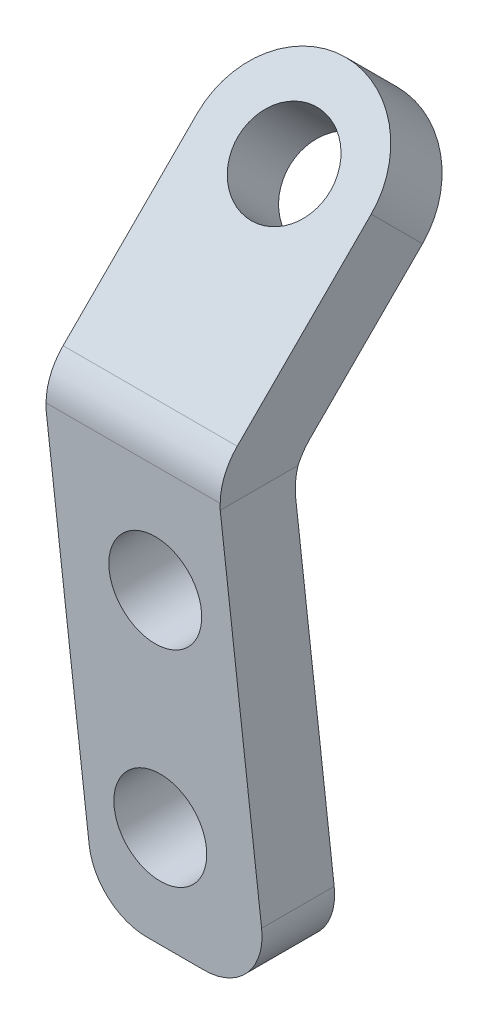
ISO-10303-21;
HEADER;
FILE_DESCRIPTION(('STEP AP214'),'2;1');
FILE_NAME('part.step','',(''),(''),'','','');
FILE_SCHEMA(('AUTOMOTIVE_DESIGN { 1 0 10303 214 1 1 1 1 }'));
ENDSEC;
DATA;
#1=APPLICATION_CONTEXT('core data for automotive mechanical design processes');
#2=APPLICATION_PROTOCOL_DEFINITION('international standard','automotive_design',2000,#1);
#3=PRODUCT_CONTEXT('',#1,'mechanical');
#4=PRODUCT('Part','Part','',(#3));
#5=PRODUCT_RELATED_PRODUCT_CATEGORY('part','',(#4));
#6=PRODUCT_DEFINITION_FORMATION('','',#4);
#7=PRODUCT_DEFINITION_CONTEXT('part definition',#1,'design');
#8=PRODUCT_DEFINITION('design','',#6,#7);
#9=PRODUCT_DEFINITION_SHAPE('','',#8);
#10=(LENGTH_UNIT() NAMED_UNIT(*) SI_UNIT(.MILLI.,.METRE.));
#11=(NAMED_UNIT(*) PLANE_ANGLE_UNIT() SI_UNIT($,.RADIAN.));
#12=(NAMED_UNIT(*) SI_UNIT($,.STERADIAN.) SOLID_ANGLE_UNIT());
#13=UNCERTAINTY_MEASURE_WITH_UNIT(LENGTH_MEASURE(1.E-05),#10,'distance_accuracy_value','');
#14=(GEOMETRIC_REPRESENTATION_CONTEXT(3) GLOBAL_UNCERTAINTY_ASSIGNED_CONTEXT((#13)) GLOBAL_UNIT_ASSIGNED_CONTEXT((#10,
#11,#12)) REPRESENTATION_CONTEXT('',''));
#15=CARTESIAN_POINT('',(0.,0.,0.));
#16=DIRECTION('',(0.,0.,1.));
#17=DIRECTION('',(1.,0.,0.));
#18=AXIS2_PLACEMENT_3D('',#15,#16,#17);
#19=CARTESIAN_POINT('',(-18.5,12.7986327394765,12.7986327394765));
#20=DIRECTION('',(0.,-0.707106781186546,-0.707106781186549));
#21=DIRECTION('',(0.,0.707106781186549,-0.707106781186546));
#22=AXIS2_PLACEMENT_3D('',#19,#20,#21);
#23=PLANE('',#22);
#24=CARTESIAN_POINT('',(-18.5,12.7986327394765,12.7986327394765));
#25=DIRECTION('',(0.,0.707106781186546,0.707106781186549));
#26=DIRECTION('',(0.,-0.707106781186549,0.707106781186546));
#27=AXIS2_PLACEMENT_3D('',#24,#25,#26);
#28=CIRCLE('',#27,1.6);
#29=CARTESIAN_POINT('',(-18.5,11.667261889578,13.930003589375));
#30=VERTEX_POINT('',#29);
#31=EDGE_CURVE('E177',#30,#30,#28,.T.);
#32=ORIENTED_EDGE('',*,*,#31,.F.);
#33=EDGE_LOOP('',(#32));
#34=FACE_BOUND('',#33,.T.);
#35=DIRECTION('',(0.,-0.707106781186549,0.707106781186546));
#36=VECTOR('',#35,1.);
#37=CARTESIAN_POINT('',(-21.5,5.72756516654719,19.8697003124058));
#38=LINE('',#37,#36);
#39=CARTESIAN_POINT('',(-21.5,12.7986329784127,12.7986325005404));
#40=VERTEX_POINT('',#39);
#41=CARTESIAN_POINT('',(-21.5,8.18305191657991,17.4142135623731));
#42=VERTEX_POINT('',#41);
#43=EDGE_CURVE('E170',#40,#42,#38,.T.);
#44=ORIENTED_EDGE('',*,*,#43,.T.);
#45=DIRECTION('',(-1.,0.,0.));
#46=VECTOR('',#45,1.);
#47=CARTESIAN_POINT('',(-15.5,8.18305191657991,17.4142135623731));
#48=LINE('',#47,#46);
#49=CARTESIAN_POINT('',(-15.5,8.18305191657991,17.4142135623731));
#50=VERTEX_POINT('',#49);
#51=EDGE_CURVE('E210',#42,#50,#48,.F.);
#52=ORIENTED_EDGE('',*,*,#51,.T.);
#53=DIRECTION('',(0.,0.707106781186549,-0.707106781186546));
#54=VECTOR('',#53,1.);
#55=CARTESIAN_POINT('',(-15.5,5.72756516654719,19.8697003124058));
#56=LINE('',#55,#54);
#57=CARTESIAN_POINT('',(-15.5,12.7986329784127,12.7986325005404));
#58=VERTEX_POINT('',#57);
#59=EDGE_CURVE('E194',#50,#58,#56,.T.);
#60=ORIENTED_EDGE('',*,*,#59,.T.);
#61=CARTESIAN_POINT('',(-18.5,12.7986327394765,12.7986327394765));
#62=DIRECTION('',(0.,0.707106781186546,0.707106781186549));
#63=DIRECTION('',(0.,0.707106781186549,-0.707106781186546));
#64=AXIS2_PLACEMENT_3D('',#61,#62,#63);
#65=CIRCLE('',#64,3.00000000000002);
#66=EDGE_CURVE('E188',#58,#40,#65,.T.);
#67=ORIENTED_EDGE('',*,*,#66,.T.);
#68=EDGE_LOOP('',(#44,#52,#60,#67));
#69=FACE_BOUND('',#68,.T.);
#70=ADVANCED_FACE('F33',(#34,#69),#23,.F.);
#71=CARTESIAN_POINT('',(-18.5,11.0308657865101,11.0308657865102));
#72=DIRECTION('',(0.,-0.707106781186546,-0.707106781186549));
#73=DIRECTION('',(0.,0.707106781186549,-0.707106781186546));
#74=AXIS2_PLACEMENT_3D('',#71,#72,#73);
#75=PLANE('',#74);
#76=DIRECTION('',(0.,0.707106781186549,-0.707106781186546));
#77=VECTOR('',#76,1.);
#78=CARTESIAN_POINT('',(-15.5,3.95979821358082,18.1019333594394));
#79=LINE('',#78,#77);
#80=CARTESIAN_POINT('',(-15.5,7.14751801064718,14.9142135623731));
#81=VERTEX_POINT('',#80);
#82=CARTESIAN_POINT('',(-15.5,11.0308660254463,11.030865547574));
#83=VERTEX_POINT('',#82);
#84=EDGE_CURVE('E186',#81,#83,#79,.T.);
#85=ORIENTED_EDGE('',*,*,#84,.F.);
#86=DIRECTION('',(-1.,0.,0.));
#87=VECTOR('',#86,1.);
#88=CARTESIAN_POINT('',(-18.5,7.14751801064718,14.9142135623731));
#89=LINE('',#88,#87);
#90=CARTESIAN_POINT('',(-21.5,7.14751801064718,14.9142135623731));
#91=VERTEX_POINT('',#90);
#92=EDGE_CURVE('E226',#81,#91,#89,.T.);
#93=ORIENTED_EDGE('',*,*,#92,.T.);
#94=DIRECTION('',(0.,-0.707106781186549,0.707106781186546));
#95=VECTOR('',#94,1.);
#96=CARTESIAN_POINT('',(-21.5,3.95979821358082,18.1019333594394));
#97=LINE('',#96,#95);
#98=CARTESIAN_POINT('',(-21.5,11.0308660254463,11.030865547574));
#99=VERTEX_POINT('',#98);
#100=EDGE_CURVE('E181',#99,#91,#97,.T.);
#101=ORIENTED_EDGE('',*,*,#100,.F.);
#102=CARTESIAN_POINT('',(-18.5,11.0308657865101,11.0308657865102));
#103=DIRECTION('',(0.,0.707106781186546,0.707106781186549));
#104=DIRECTION('',(0.,0.707106781186549,-0.707106781186546));
#105=AXIS2_PLACEMENT_3D('',#102,#103,#104);
#106=CIRCLE('',#105,3.00000000000002);
#107=EDGE_CURVE('E185',#83,#99,#106,.T.);
#108=ORIENTED_EDGE('',*,*,#107,.F.);
#109=EDGE_LOOP('',(#85,#93,#101,#108));
#110=FACE_BOUND('',#109,.T.);
#111=CARTESIAN_POINT('',(-18.5,11.0308657865101,11.0308657865102));
#112=DIRECTION('',(0.,0.707106781186546,0.707106781186549));
#113=DIRECTION('',(0.,-0.707106781186549,0.707106781186546));
#114=AXIS2_PLACEMENT_3D('',#111,#112,#113);
#115=CIRCLE('',#114,1.6);
#116=CARTESIAN_POINT('',(-18.5,9.89949493661164,12.1622366364086));
#117=VERTEX_POINT('',#116);
#118=EDGE_CURVE('E173',#117,#117,#115,.F.);
#119=ORIENTED_EDGE('',*,*,#118,.F.);
#120=EDGE_LOOP('',(#119));
#121=FACE_BOUND('',#120,.T.);
#122=ADVANCED_FACE('F250',(#110,#121),#75,.T.);
#123=CARTESIAN_POINT('',(-15.5,5.72756516654719,19.8697003124058));
#124=DIRECTION('',(-1.,0.,0.));
#125=DIRECTION('',(0.,-1.,0.));
#126=AXIS2_PLACEMENT_3D('',#123,#124,#125);
#127=PLANE('',#126);
#128=ORIENTED_EDGE('',*,*,#59,.F.);
#129=CARTESIAN_POINT('',(-15.5,6.76883835420682,16.));
#130=DIRECTION('',(-1.,0.,0.));
#131=DIRECTION('',(0.,-1.,0.));
#132=AXIS2_PLACEMENT_3D('',#129,#130,#131);
#133=CIRCLE('',#132,2.);
#134=CARTESIAN_POINT('',(-15.5,6.76883835420682,18.));
#135=VERTEX_POINT('',#134);
#136=EDGE_CURVE('E145',#50,#135,#133,.F.);
#137=ORIENTED_EDGE('',*,*,#136,.T.);
#138=DIRECTION('',(0.,1.,0.));
#139=VECTOR('',#138,1.);
#140=CARTESIAN_POINT('',(-15.5,6.56173157302027,18.));
#141=LINE('',#140,#139);
#142=CARTESIAN_POINT('',(-15.5,6.56173157302027,18.));
#143=VERTEX_POINT('',#142);
#144=EDGE_CURVE('E126',#143,#135,#141,.T.);
#145=ORIENTED_EDGE('',*,*,#144,.F.);
#146=DIRECTION('',(0.,0.,-1.));
#147=VECTOR('',#146,1.);
#148=CARTESIAN_POINT('',(-15.5,6.56173157302027,18.));
#149=LINE('',#148,#147);
#150=CARTESIAN_POINT('',(-15.5,6.56173157302027,15.3203594422489));
#151=VERTEX_POINT('',#150);
#152=EDGE_CURVE('E47',#143,#151,#149,.T.);
#153=ORIENTED_EDGE('',*,*,#152,.T.);
#154=CARTESIAN_POINT('',(-15.5,5.73330444827409,13.5));
#155=DIRECTION('',(-1.,0.,0.));
#156=DIRECTION('',(0.,-1.,0.));
#157=AXIS2_PLACEMENT_3D('',#154,#155,#156);
#158=CIRCLE('',#157,2.);
#159=EDGE_CURVE('E11',#151,#81,#158,.T.);
#160=ORIENTED_EDGE('',*,*,#159,.T.);
#161=ORIENTED_EDGE('',*,*,#84,.T.);
#162=DIRECTION('',(0.,-0.707106781186546,-0.707106781186549));
#163=VECTOR('',#162,1.);
#164=CARTESIAN_POINT('',(-15.5,12.7986329784127,12.7986325005404));
#165=LINE('',#164,#163);
#166=EDGE_CURVE('E182',#58,#83,#165,.T.);
#167=ORIENTED_EDGE('',*,*,#166,.F.);
#168=EDGE_LOOP('',(#128,#137,#145,#153,#160,#161,#167));
#169=FACE_BOUND('',#168,.T.);
#170=ADVANCED_FACE('F143',(#169),#127,.F.);
#171=CARTESIAN_POINT('',(-18.5,12.7986327394765,12.7986327394765));
#172=DIRECTION('',(0.,-0.707106781186546,-0.707106781186549));
#173=DIRECTION('',(0.,0.707106781186549,-0.707106781186546));
#174=AXIS2_PLACEMENT_3D('',#171,#172,#173);
#175=CYLINDRICAL_SURFACE('',#174,3.00000000000002);
#176=ORIENTED_EDGE('',*,*,#107,.T.);
#177=DIRECTION('',(0.,-0.707106781186546,-0.707106781186549));
#178=VECTOR('',#177,1.);
#179=CARTESIAN_POINT('',(-21.5,12.7986329784127,12.7986325005404));
#180=LINE('',#179,#178);
#181=EDGE_CURVE('E178',#40,#99,#180,.T.);
#182=ORIENTED_EDGE('',*,*,#181,.F.);
#183=ORIENTED_EDGE('',*,*,#66,.F.);
#184=ORIENTED_EDGE('',*,*,#166,.T.);
#185=EDGE_LOOP('',(#176,#182,#183,#184));
#186=FACE_BOUND('',#185,.T.);
#187=ADVANCED_FACE('F255',(#186),#175,.T.);
#188=CARTESIAN_POINT('',(-18.5,12.7986327394765,12.7986327394765));
#189=DIRECTION('',(0.,-0.707106781186546,-0.707106781186549));
#190=DIRECTION('',(0.,0.707106781186549,-0.707106781186546));
#191=AXIS2_PLACEMENT_3D('',#188,#189,#190);
#192=CYLINDRICAL_SURFACE('',#191,1.6);
#193=ORIENTED_EDGE('',*,*,#31,.T.);
#194=EDGE_LOOP('',(#193));
#195=FACE_BOUND('',#194,.T.);
#196=ORIENTED_EDGE('',*,*,#118,.T.);
#197=EDGE_LOOP('',(#196));
#198=FACE_BOUND('',#197,.T.);
#199=ADVANCED_FACE('F273',(#195,#198),#192,.F.);
#200=CARTESIAN_POINT('',(0.,0.,15.5));
#201=DIRECTION('',(0.,0.,1.));
#202=DIRECTION('',(1.,0.,0.));
#203=AXIS2_PLACEMENT_3D('',#200,#201,#202);
#204=PLANE('',#203);
#205=CARTESIAN_POINT('',(-17.564365692009,-3.93612218272979,15.5));
#206=DIRECTION('',(0.,0.,-1.));
#207=DIRECTION('',(-1.,0.,0.));
#208=AXIS2_PLACEMENT_3D('',#205,#206,#207);
#209=CIRCLE('',#208,1.6);
#210=CARTESIAN_POINT('',(-19.164365692009,-3.93612218272979,15.5));
#211=VERTEX_POINT('',#210);
#212=EDGE_CURVE('E159',#211,#211,#209,.T.);
#213=ORIENTED_EDGE('',*,*,#212,.F.);
#214=EDGE_LOOP('',(#213));
#215=FACE_BOUND('',#214,.T.);
#216=CARTESIAN_POINT('',(-17.7376943195775,3.06173157302027,15.5));
#217=DIRECTION('',(0.,0.,-1.));
#218=DIRECTION('',(-1.,0.,0.));
#219=AXIS2_PLACEMENT_3D('',#216,#217,#218);
#220=CIRCLE('',#219,1.6);
#221=CARTESIAN_POINT('',(-19.3376943195775,3.06173157302027,15.5));
#222=VERTEX_POINT('',#221);
#223=EDGE_CURVE('E164',#222,#222,#220,.T.);
#224=ORIENTED_EDGE('',*,*,#223,.F.);
#225=EDGE_LOOP('',(#224));
#226=FACE_BOUND('',#225,.T.);
#227=DIRECTION('',(-0.120424606683781,0.992722475873825,0.));
#228=VECTOR('',#227,1.);
#229=CARTESIAN_POINT('',(-13.8020865915625,-7.43504906060482,15.5));
#230=LINE('',#229,#228);
#231=CARTESIAN_POINT('',(-14.0739182380858,-5.19419984723726,15.5));
#232=VERTEX_POINT('',#231);
#233=CARTESIAN_POINT('',(-15.399505639201,5.73330444827408,15.5));
#234=VERTEX_POINT('',#233);
#235=EDGE_CURVE('E152',#232,#234,#230,.T.);
#236=ORIENTED_EDGE('',*,*,#235,.F.);
#237=CARTESIAN_POINT('',(-16.0593631898334,-5.43504906060482,15.5));
#238=DIRECTION('',(0.,0.,1.));
#239=DIRECTION('',(1.,0.,0.));
#240=AXIS2_PLACEMENT_3D('',#237,#238,#239);
#241=CIRCLE('',#240,2.);
#242=CARTESIAN_POINT('',(-16.0593631898334,-7.43504906060482,15.5));
#243=VERTEX_POINT('',#242);
#244=EDGE_CURVE('E219',#232,#243,#241,.F.);
#245=ORIENTED_EDGE('',*,*,#244,.T.);
#246=DIRECTION('',(1.,0.,0.));
#247=VECTOR('',#246,1.);
#248=CARTESIAN_POINT('',(-19.8020865915625,-7.43504906060482,15.5));
#249=LINE('',#248,#247);
#250=CARTESIAN_POINT('',(-18.0300396908575,-7.43504906060482,15.5));
#251=VERTEX_POINT('',#250);
#252=EDGE_CURVE('E134',#251,#243,#249,.T.);
#253=ORIENTED_EDGE('',*,*,#252,.F.);
#254=CARTESIAN_POINT('',(-18.0300396908575,-5.43504906060482,15.5));
#255=DIRECTION('',(0.,0.,1.));
#256=DIRECTION('',(1.,0.,0.));
#257=AXIS2_PLACEMENT_3D('',#254,#255,#256);
#258=CIRCLE('',#257,2.);
#259=CARTESIAN_POINT('',(-20.0154846426051,-5.67589827397238,15.5));
#260=VERTEX_POINT('',#259);
#261=EDGE_CURVE('E215',#251,#260,#258,.F.);
#262=ORIENTED_EDGE('',*,*,#261,.T.);
#263=DIRECTION('',(0.120424606683781,-0.992722475873825,0.));
#264=VECTOR('',#263,1.);
#265=CARTESIAN_POINT('',(-21.5,6.56173157302027,15.5));
#266=LINE('',#265,#264);
#267=CARTESIAN_POINT('',(-21.399505639201,5.73330444827409,15.5));
#268=VERTEX_POINT('',#267);
#269=EDGE_CURVE('E154',#268,#260,#266,.T.);
#270=ORIENTED_EDGE('',*,*,#269,.F.);
#271=DIRECTION('',(-1.,0.,0.));
#272=VECTOR('',#271,1.);
#273=CARTESIAN_POINT('',(0.,5.73330444827409,15.5));
#274=LINE('',#273,#272);
#275=EDGE_CURVE('E217',#268,#234,#274,.F.);
#276=ORIENTED_EDGE('',*,*,#275,.T.);
#277=EDGE_LOOP('',(#236,#245,#253,#262,#270,#276));
#278=FACE_BOUND('',#277,.T.);
#279=ADVANCED_FACE('F242',(#215,#226,#278),#204,.F.);
#280=CARTESIAN_POINT('',(0.,0.,18.));
#281=DIRECTION('',(0.,0.,1.));
#282=DIRECTION('',(1.,0.,0.));
#283=AXIS2_PLACEMENT_3D('',#280,#281,#282);
#284=PLANE('',#283);
#285=CARTESIAN_POINT('',(-17.564365692009,-3.93612218272979,18.));
#286=DIRECTION('',(0.,0.,-1.));
#287=DIRECTION('',(-1.,0.,0.));
#288=AXIS2_PLACEMENT_3D('',#285,#286,#287);
#289=CIRCLE('',#288,1.6);
#290=CARTESIAN_POINT('',(-19.164365692009,-3.93612218272979,18.));
#291=VERTEX_POINT('',#290);
#292=EDGE_CURVE('E161',#291,#291,#289,.T.);
#293=ORIENTED_EDGE('',*,*,#292,.T.);
#294=EDGE_LOOP('',(#293));
#295=FACE_BOUND('',#294,.T.);
#296=ORIENTED_EDGE('',*,*,#144,.T.);
#297=DIRECTION('',(-1.,0.,0.));
#298=VECTOR('',#297,1.);
#299=CARTESIAN_POINT('',(-21.5,6.76883835420682,18.));
#300=LINE('',#299,#298);
#301=CARTESIAN_POINT('',(-21.5,6.76883835420682,18.));
#302=VERTEX_POINT('',#301);
#303=EDGE_CURVE('E206',#135,#302,#300,.T.);
#304=ORIENTED_EDGE('',*,*,#303,.T.);
#305=DIRECTION('',(0.,1.,0.));
#306=VECTOR('',#305,1.);
#307=CARTESIAN_POINT('',(-21.5,0.,18.));
#308=LINE('',#307,#306);
#309=CARTESIAN_POINT('',(-21.5,6.56173157302027,18.));
#310=VERTEX_POINT('',#309);
#311=EDGE_CURVE('E176',#310,#302,#308,.T.);
#312=ORIENTED_EDGE('',*,*,#311,.F.);
#313=DIRECTION('',(0.120424606683781,-0.992722475873825,0.));
#314=VECTOR('',#313,1.);
#315=CARTESIAN_POINT('',(-21.5,6.56173157302027,18.));
#316=LINE('',#315,#314);
#317=CARTESIAN_POINT('',(-20.0154846426051,-5.67589827397238,18.));
#318=VERTEX_POINT('',#317);
#319=EDGE_CURVE('E146',#310,#318,#316,.T.);
#320=ORIENTED_EDGE('',*,*,#319,.T.);
#321=CARTESIAN_POINT('',(-18.0300396908575,-5.43504906060482,18.));
#322=DIRECTION('',(0.,0.,1.));
#323=DIRECTION('',(1.,0.,0.));
#324=AXIS2_PLACEMENT_3D('',#321,#322,#323);
#325=CIRCLE('',#324,2.);
#326=CARTESIAN_POINT('',(-18.0300396908575,-7.43504906060482,18.));
#327=VERTEX_POINT('',#326);
#328=EDGE_CURVE('E191',#318,#327,#325,.T.);
#329=ORIENTED_EDGE('',*,*,#328,.T.);
#330=DIRECTION('',(1.,0.,0.));
#331=VECTOR('',#330,1.);
#332=CARTESIAN_POINT('',(-19.8020865915625,-7.43504906060482,18.));
#333=LINE('',#332,#331);
#334=CARTESIAN_POINT('',(-16.0593631898334,-7.43504906060482,18.));
#335=VERTEX_POINT('',#334);
#336=EDGE_CURVE('E140',#327,#335,#333,.T.);
#337=ORIENTED_EDGE('',*,*,#336,.T.);
#338=CARTESIAN_POINT('',(-16.0593631898334,-5.43504906060482,18.));
#339=DIRECTION('',(0.,0.,1.));
#340=DIRECTION('',(1.,0.,0.));
#341=AXIS2_PLACEMENT_3D('',#338,#339,#340);
#342=CIRCLE('',#341,2.);
#343=CARTESIAN_POINT('',(-14.0739182380858,-5.19419984723726,18.));
#344=VERTEX_POINT('',#343);
#345=EDGE_CURVE('E130',#335,#344,#342,.T.);
#346=ORIENTED_EDGE('',*,*,#345,.T.);
#347=DIRECTION('',(-0.120424606683781,0.992722475873825,0.));
#348=VECTOR('',#347,1.);
#349=CARTESIAN_POINT('',(-13.8020865915625,-7.43504906060482,18.));
#350=LINE('',#349,#348);
#351=EDGE_CURVE('E122',#344,#143,#350,.T.);
#352=ORIENTED_EDGE('',*,*,#351,.T.);
#353=EDGE_LOOP('',(#296,#304,#312,#320,#329,#337,#346,#352));
#354=FACE_BOUND('',#353,.T.);
#355=CARTESIAN_POINT('',(-17.7376943195775,3.06173157302027,18.));
#356=DIRECTION('',(0.,0.,-1.));
#357=DIRECTION('',(-1.,0.,0.));
#358=AXIS2_PLACEMENT_3D('',#355,#356,#357);
#359=CIRCLE('',#358,1.6);
#360=CARTESIAN_POINT('',(-19.3376943195775,3.06173157302027,18.));
#361=VERTEX_POINT('',#360);
#362=EDGE_CURVE('E167',#361,#361,#359,.T.);
#363=ORIENTED_EDGE('',*,*,#362,.T.);
#364=EDGE_LOOP('',(#363));
#365=FACE_BOUND('',#364,.T.);
#366=ADVANCED_FACE('F123',(#295,#354,#365),#284,.T.);
#367=CARTESIAN_POINT('',(-21.5,5.72756516654719,19.8697003124058));
#368=DIRECTION('',(1.,0.,0.));
#369=DIRECTION('',(0.,0.,-1.));
#370=AXIS2_PLACEMENT_3D('',#367,#368,#369);
#371=PLANE('',#370);
#372=ORIENTED_EDGE('',*,*,#311,.T.);
#373=CARTESIAN_POINT('',(-21.5,6.76883835420682,16.));
#374=DIRECTION('',(1.,0.,0.));
#375=DIRECTION('',(0.,0.,-1.));
#376=AXIS2_PLACEMENT_3D('',#373,#374,#375);
#377=CIRCLE('',#376,2.);
#378=EDGE_CURVE('E208',#302,#42,#377,.F.);
#379=ORIENTED_EDGE('',*,*,#378,.T.);
#380=ORIENTED_EDGE('',*,*,#43,.F.);
#381=ORIENTED_EDGE('',*,*,#181,.T.);
#382=ORIENTED_EDGE('',*,*,#100,.T.);
#383=CARTESIAN_POINT('',(-21.5,5.73330444827408,13.5));
#384=DIRECTION('',(1.,0.,0.));
#385=DIRECTION('',(0.,0.,-1.));
#386=AXIS2_PLACEMENT_3D('',#383,#384,#385);
#387=CIRCLE('',#386,2.);
#388=CARTESIAN_POINT('',(-21.5,6.56173157302027,15.3203594422489));
#389=VERTEX_POINT('',#388);
#390=EDGE_CURVE('E231',#91,#389,#387,.T.);
#391=ORIENTED_EDGE('',*,*,#390,.T.);
#392=DIRECTION('',(0.,0.,-1.));
#393=VECTOR('',#392,1.);
#394=CARTESIAN_POINT('',(-21.5,6.56173157302027,18.));
#395=LINE('',#394,#393);
#396=EDGE_CURVE('E55',#310,#389,#395,.T.);
#397=ORIENTED_EDGE('',*,*,#396,.F.);
#398=EDGE_LOOP('',(#372,#379,#380,#381,#382,#391,#397));
#399=FACE_BOUND('',#398,.T.);
#400=ADVANCED_FACE('F262',(#399),#371,.F.);
#401=CARTESIAN_POINT('',(-13.8020865915625,-7.43504906060482,18.));
#402=DIRECTION('',(-0.992722475873825,-0.120424606683781,0.));
#403=DIRECTION('',(0.120424606683781,-0.992722475873825,0.));
#404=AXIS2_PLACEMENT_3D('',#401,#402,#403);
#405=PLANE('',#404);
#406=ORIENTED_EDGE('',*,*,#351,.F.);
#407=DIRECTION('',(0.,0.,-1.));
#408=VECTOR('',#407,1.);
#409=CARTESIAN_POINT('',(-14.0739182380858,-5.19419984723725,18.));
#410=LINE('',#409,#408);
#411=EDGE_CURVE('E213',#344,#232,#410,.T.);
#412=ORIENTED_EDGE('',*,*,#411,.T.);
#413=ORIENTED_EDGE('',*,*,#235,.T.);
#414=CARTESIAN_POINT('',(-15.399505639201,5.73330444827409,13.5));
#415=DIRECTION('',(-0.992722475873825,-0.120424606683781,0.));
#416=DIRECTION('',(-0.120424606683781,0.992722475873825,0.));
#417=AXIS2_PLACEMENT_3D('',#414,#415,#416);
#418=ELLIPSE('',#417,2.01466174948798,2.);
#419=EDGE_CURVE('E41',#234,#151,#418,.T.);
#420=ORIENTED_EDGE('',*,*,#419,.T.);
#421=ORIENTED_EDGE('',*,*,#152,.F.);
#422=EDGE_LOOP('',(#406,#412,#413,#420,#421));
#423=FACE_BOUND('',#422,.T.);
#424=ADVANCED_FACE('F136',(#423),#405,.F.);
#425=CARTESIAN_POINT('',(-19.8020865915625,-7.43504906060482,18.));
#426=DIRECTION('',(0.,1.,0.));
#427=DIRECTION('',(-1.,0.,0.));
#428=AXIS2_PLACEMENT_3D('',#425,#426,#427);
#429=PLANE('',#428);
#430=ORIENTED_EDGE('',*,*,#252,.T.);
#431=DIRECTION('',(0.,0.,-1.));
#432=VECTOR('',#431,1.);
#433=CARTESIAN_POINT('',(-16.0593631898334,-7.43504906060482,18.));
#434=LINE('',#433,#432);
#435=EDGE_CURVE('E224',#243,#335,#434,.F.);
#436=ORIENTED_EDGE('',*,*,#435,.T.);
#437=ORIENTED_EDGE('',*,*,#336,.F.);
#438=DIRECTION('',(0.,0.,-1.));
#439=VECTOR('',#438,1.);
#440=CARTESIAN_POINT('',(-18.0300396908575,-7.43504906060482,18.));
#441=LINE('',#440,#439);
#442=EDGE_CURVE('E221',#327,#251,#441,.T.);
#443=ORIENTED_EDGE('',*,*,#442,.T.);
#444=EDGE_LOOP('',(#430,#436,#437,#443));
#445=FACE_BOUND('',#444,.T.);
#446=ADVANCED_FACE('F300',(#445),#429,.F.);
#447=CARTESIAN_POINT('',(-21.5,6.56173157302027,18.));
#448=DIRECTION('',(0.992722475873825,0.120424606683781,0.));
#449=DIRECTION('',(-0.120424606683781,0.992722475873825,0.));
#450=AXIS2_PLACEMENT_3D('',#447,#448,#449);
#451=PLANE('',#450);
#452=ORIENTED_EDGE('',*,*,#269,.T.);
#453=DIRECTION('',(0.,0.,-1.));
#454=VECTOR('',#453,1.);
#455=CARTESIAN_POINT('',(-20.0154846426051,-5.67589827397238,18.));
#456=LINE('',#455,#454);
#457=EDGE_CURVE('E229',#260,#318,#456,.F.);
#458=ORIENTED_EDGE('',*,*,#457,.T.);
#459=ORIENTED_EDGE('',*,*,#319,.F.);
#460=ORIENTED_EDGE('',*,*,#396,.T.);
#461=CARTESIAN_POINT('',(-21.399505639201,5.73330444827408,13.5));
#462=DIRECTION('',(0.992722475873825,0.120424606683781,0.));
#463=DIRECTION('',(-0.120424606683781,0.992722475873825,0.));
#464=AXIS2_PLACEMENT_3D('',#461,#462,#463);
#465=ELLIPSE('',#464,2.01466174948798,2.);
#466=EDGE_CURVE('E233',#389,#268,#465,.T.);
#467=ORIENTED_EDGE('',*,*,#466,.T.);
#468=EDGE_LOOP('',(#452,#458,#459,#460,#467));
#469=FACE_BOUND('',#468,.T.);
#470=ADVANCED_FACE('F236',(#469),#451,.F.);
#471=CARTESIAN_POINT('',(-17.7376943195775,3.06173157302027,18.));
#472=DIRECTION('',(0.,0.,-1.));
#473=DIRECTION('',(-1.,0.,0.));
#474=AXIS2_PLACEMENT_3D('',#471,#472,#473);
#475=CYLINDRICAL_SURFACE('',#474,1.6);
#476=ORIENTED_EDGE('',*,*,#362,.F.);
#477=EDGE_LOOP('',(#476));
#478=FACE_BOUND('',#477,.T.);
#479=ORIENTED_EDGE('',*,*,#223,.T.);
#480=EDGE_LOOP('',(#479));
#481=FACE_BOUND('',#480,.T.);
#482=ADVANCED_FACE('F308',(#478,#481),#475,.F.);
#483=CARTESIAN_POINT('',(-17.564365692009,-3.93612218272979,18.));
#484=DIRECTION('',(0.,0.,-1.));
#485=DIRECTION('',(-1.,0.,0.));
#486=AXIS2_PLACEMENT_3D('',#483,#484,#485);
#487=CYLINDRICAL_SURFACE('',#486,1.6);
#488=ORIENTED_EDGE('',*,*,#292,.F.);
#489=EDGE_LOOP('',(#488));
#490=FACE_BOUND('',#489,.T.);
#491=ORIENTED_EDGE('',*,*,#212,.T.);
#492=EDGE_LOOP('',(#491));
#493=FACE_BOUND('',#492,.T.);
#494=ADVANCED_FACE('F286',(#490,#493),#487,.F.);
#495=CARTESIAN_POINT('',(0.,6.76883835420682,16.));
#496=DIRECTION('',(1.,0.,0.));
#497=DIRECTION('',(0.,1.,0.));
#498=AXIS2_PLACEMENT_3D('',#495,#496,#497);
#499=CYLINDRICAL_SURFACE('',#498,2.);
#500=ORIENTED_EDGE('',*,*,#136,.F.);
#501=ORIENTED_EDGE('',*,*,#51,.F.);
#502=ORIENTED_EDGE('',*,*,#378,.F.);
#503=ORIENTED_EDGE('',*,*,#303,.F.);
#504=EDGE_LOOP('',(#500,#501,#502,#503));
#505=FACE_BOUND('',#504,.T.);
#506=ADVANCED_FACE('F259',(#505),#499,.T.);
#507=CARTESIAN_POINT('',(-16.0593631898334,-5.43504906060482,18.));
#508=DIRECTION('',(0.,0.,-1.));
#509=DIRECTION('',(-1.,0.,0.));
#510=AXIS2_PLACEMENT_3D('',#507,#508,#509);
#511=CYLINDRICAL_SURFACE('',#510,2.);
#512=ORIENTED_EDGE('',*,*,#345,.F.);
#513=ORIENTED_EDGE('',*,*,#435,.F.);
#514=ORIENTED_EDGE('',*,*,#244,.F.);
#515=ORIENTED_EDGE('',*,*,#411,.F.);
#516=EDGE_LOOP('',(#512,#513,#514,#515));
#517=FACE_BOUND('',#516,.T.);
#518=ADVANCED_FACE('F285',(#517),#511,.T.);
#519=CARTESIAN_POINT('',(-18.5,5.73330444827409,13.5));
#520=DIRECTION('',(-1.,0.,0.));
#521=DIRECTION('',(0.,-1.,0.));
#522=AXIS2_PLACEMENT_3D('',#519,#520,#521);
#523=CYLINDRICAL_SURFACE('',#522,2.);
#524=ORIENTED_EDGE('',*,*,#419,.F.);
#525=ORIENTED_EDGE('',*,*,#275,.F.);
#526=ORIENTED_EDGE('',*,*,#466,.F.);
#527=ORIENTED_EDGE('',*,*,#390,.F.);
#528=ORIENTED_EDGE('',*,*,#92,.F.);
#529=ORIENTED_EDGE('',*,*,#159,.F.);
#530=EDGE_LOOP('',(#524,#525,#526,#527,#528,#529));
#531=FACE_BOUND('',#530,.T.);
#532=ADVANCED_FACE('F244',(#531),#523,.F.);
#533=CARTESIAN_POINT('',(-18.0300396908575,-5.43504906060482,18.));
#534=DIRECTION('',(0.,0.,-1.));
#535=DIRECTION('',(-1.,0.,0.));
#536=AXIS2_PLACEMENT_3D('',#533,#534,#535);
#537=CYLINDRICAL_SURFACE('',#536,2.);
#538=ORIENTED_EDGE('',*,*,#328,.F.);
#539=ORIENTED_EDGE('',*,*,#457,.F.);
#540=ORIENTED_EDGE('',*,*,#261,.F.);
#541=ORIENTED_EDGE('',*,*,#442,.F.);
#542=EDGE_LOOP('',(#538,#539,#540,#541));
#543=FACE_BOUND('',#542,.T.);
#544=ADVANCED_FACE('F35',(#543),#537,.T.);
#545=CLOSED_SHELL('',(#70,#122,#170,#187,#199,#279,#366,#400,#424,#446,#470,#482,#494,#506,#518,
#532,#544));
#546=MANIFOLD_SOLID_BREP('B2',#545);
#547=ADVANCED_BREP_SHAPE_REPRESENTATION('',(#18,#546),#14);
#548=SHAPE_DEFINITION_REPRESENTATION(#9,#547);
ENDSEC;
END-ISO-10303-21;
